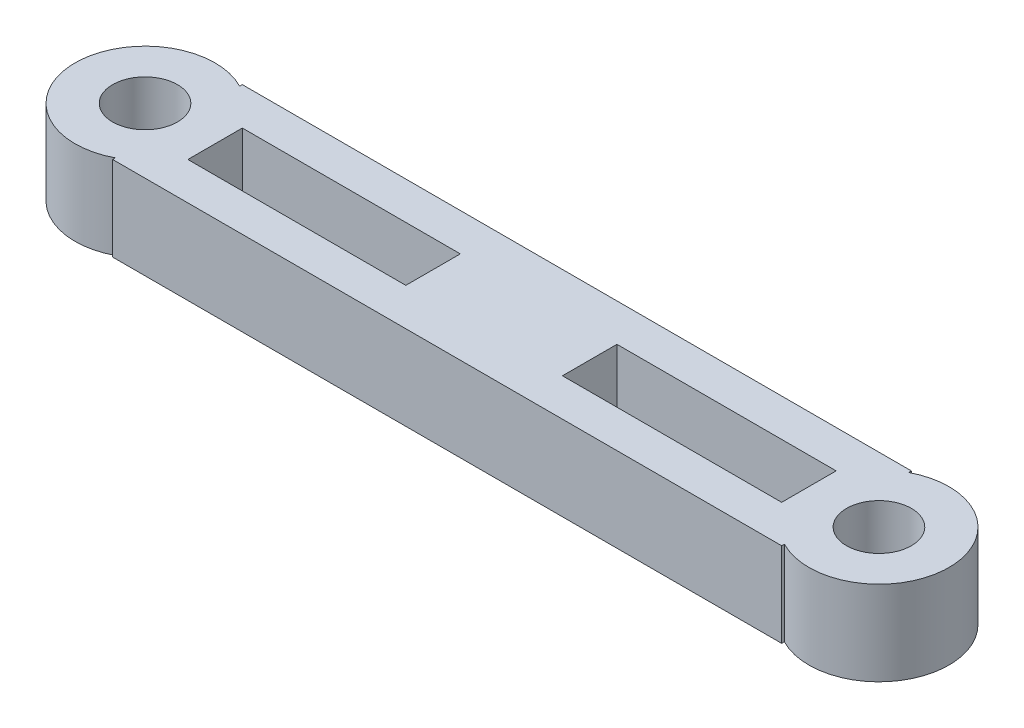
ISO-10303-21;
HEADER;
FILE_DESCRIPTION(('STEP AP214'),'2;1');
FILE_NAME('part.step','',(''),(''),'','','');
FILE_SCHEMA(('AUTOMOTIVE_DESIGN { 1 0 10303 214 1 1 1 1 }'));
ENDSEC;
DATA;
#1=APPLICATION_CONTEXT('core data for automotive mechanical design processes');
#2=APPLICATION_PROTOCOL_DEFINITION('international standard','automotive_design',2000,#1);
#3=PRODUCT_CONTEXT('',#1,'mechanical');
#4=PRODUCT('Part','Part','',(#3));
#5=PRODUCT_RELATED_PRODUCT_CATEGORY('part','',(#4));
#6=PRODUCT_DEFINITION_FORMATION('','',#4);
#7=PRODUCT_DEFINITION_CONTEXT('part definition',#1,'design');
#8=PRODUCT_DEFINITION('design','',#6,#7);
#9=PRODUCT_DEFINITION_SHAPE('','',#8);
#10=(LENGTH_UNIT() NAMED_UNIT(*) SI_UNIT(.MILLI.,.METRE.));
#11=(NAMED_UNIT(*) PLANE_ANGLE_UNIT() SI_UNIT($,.RADIAN.));
#12=(NAMED_UNIT(*) SI_UNIT($,.STERADIAN.) SOLID_ANGLE_UNIT());
#13=UNCERTAINTY_MEASURE_WITH_UNIT(LENGTH_MEASURE(1.E-05),#10,'distance_accuracy_value','');
#14=(GEOMETRIC_REPRESENTATION_CONTEXT(3) GLOBAL_UNCERTAINTY_ASSIGNED_CONTEXT((#13)) GLOBAL_UNIT_ASSIGNED_CONTEXT((#10,
#11,#12)) REPRESENTATION_CONTEXT('',''));
#15=CARTESIAN_POINT('',(0.,0.,0.));
#16=DIRECTION('',(0.,0.,1.));
#17=DIRECTION('',(1.,0.,0.));
#18=AXIS2_PLACEMENT_3D('',#15,#16,#17);
#19=CARTESIAN_POINT('',(11.3046804357248,2.78834830224153,-2.19075));
#20=DIRECTION('',(-1.,0.,0.));
#21=DIRECTION('',(0.,0.,1.));
#22=AXIS2_PLACEMENT_3D('',#19,#20,#21);
#23=PLANE('',#22);
#24=DIRECTION('',(0.,0.,1.));
#25=VECTOR('',#24,1.);
#26=CARTESIAN_POINT('',(11.3046804357248,12.7,-2.19075));
#27=LINE('',#26,#25);
#28=CARTESIAN_POINT('',(11.3046804357248,12.7,-2.19075));
#29=VERTEX_POINT('',#28);
#30=CARTESIAN_POINT('',(11.3046804357248,12.7,-2.09835770191108));
#31=VERTEX_POINT('',#30);
#32=EDGE_CURVE('E164',#29,#31,#27,.T.);
#33=ORIENTED_EDGE('',*,*,#32,.T.);
#34=DIRECTION('',(0.,1.,0.));
#35=VECTOR('',#34,1.);
#36=CARTESIAN_POINT('',(11.3046804357248,3.14745619981796,-2.09835770191108));
#37=LINE('',#36,#35);
#38=CARTESIAN_POINT('',(11.3046804357248,9.8425,-2.09835770191108));
#39=VERTEX_POINT('',#38);
#40=EDGE_CURVE('E51',#31,#39,#37,.F.);
#41=ORIENTED_EDGE('',*,*,#40,.T.);
#42=DIRECTION('',(0.,0.,1.));
#43=VECTOR('',#42,1.);
#44=CARTESIAN_POINT('',(11.3046804357248,9.8425,-2.19075));
#45=LINE('',#44,#43);
#46=CARTESIAN_POINT('',(11.3046804357248,9.8425,-2.19075));
#47=VERTEX_POINT('',#46);
#48=EDGE_CURVE('E161',#47,#39,#45,.T.);
#49=ORIENTED_EDGE('',*,*,#48,.F.);
#50=DIRECTION('',(0.,-1.,0.));
#51=VECTOR('',#50,1.);
#52=CARTESIAN_POINT('',(11.3046804357248,6.35,-2.19075));
#53=LINE('',#52,#51);
#54=EDGE_CURVE('E243',#29,#47,#53,.T.);
#55=ORIENTED_EDGE('',*,*,#54,.F.);
#56=EDGE_LOOP('',(#33,#41,#49,#55));
#57=FACE_BOUND('',#56,.T.);
#58=ADVANCED_FACE('F43',(#57),#23,.F.);
#59=CARTESIAN_POINT('',(-11.3046804357248,2.78834830224153,-2.19075));
#60=DIRECTION('',(1.,0.,0.));
#61=DIRECTION('',(0.,0.,-1.));
#62=AXIS2_PLACEMENT_3D('',#59,#60,#61);
#63=PLANE('',#62);
#64=DIRECTION('',(0.,0.,-1.));
#65=VECTOR('',#64,1.);
#66=CARTESIAN_POINT('',(-11.3046804357248,12.7,-2.19075));
#67=LINE('',#66,#65);
#68=CARTESIAN_POINT('',(-11.3046804357248,12.7,2.19075));
#69=VERTEX_POINT('',#68);
#70=CARTESIAN_POINT('',(-11.3046804357248,12.7,2.09835770191107));
#71=VERTEX_POINT('',#70);
#72=EDGE_CURVE('E283',#69,#71,#67,.T.);
#73=ORIENTED_EDGE('',*,*,#72,.T.);
#74=DIRECTION('',(0.,1.,0.));
#75=VECTOR('',#74,1.);
#76=CARTESIAN_POINT('',(-11.3046804357248,3.14745619981796,2.09835770191107));
#77=LINE('',#76,#75);
#78=CARTESIAN_POINT('',(-11.3046804357248,9.8425,2.09835770191107));
#79=VERTEX_POINT('',#78);
#80=EDGE_CURVE('E264',#71,#79,#77,.F.);
#81=ORIENTED_EDGE('',*,*,#80,.T.);
#82=DIRECTION('',(0.,0.,-1.));
#83=VECTOR('',#82,1.);
#84=CARTESIAN_POINT('',(-11.3046804357248,9.8425,-2.19075));
#85=LINE('',#84,#83);
#86=CARTESIAN_POINT('',(-11.3046804357248,9.8425,2.19075));
#87=VERTEX_POINT('',#86);
#88=EDGE_CURVE('E177',#87,#79,#85,.T.);
#89=ORIENTED_EDGE('',*,*,#88,.F.);
#90=DIRECTION('',(0.,-1.,0.));
#91=VECTOR('',#90,1.);
#92=CARTESIAN_POINT('',(-11.3046804357248,6.35,2.19075));
#93=LINE('',#92,#91);
#94=EDGE_CURVE('E248',#69,#87,#93,.T.);
#95=ORIENTED_EDGE('',*,*,#94,.F.);
#96=EDGE_LOOP('',(#73,#81,#89,#95));
#97=FACE_BOUND('',#96,.T.);
#98=ADVANCED_FACE('F311',(#97),#63,.F.);
#99=CARTESIAN_POINT('',(-11.3046804357248,12.7,0.));
#100=DIRECTION('',(0.,1.,0.));
#101=DIRECTION('',(0.,0.,1.));
#102=AXIS2_PLACEMENT_3D('',#99,#100,#101);
#103=PLANE('',#102);
#104=DIRECTION('',(1.,0.,0.));
#105=VECTOR('',#104,1.);
#106=CARTESIAN_POINT('',(0.,12.7,-0.920750000000002));
#107=LINE('',#106,#105);
#108=CARTESIAN_POINT('',(2.62570322069643,12.7,-0.920750000000002));
#109=VERTEX_POINT('',#108);
#110=CARTESIAN_POINT('',(10.033,12.7,-0.920750000000002));
#111=VERTEX_POINT('',#110);
#112=EDGE_CURVE('E229',#109,#111,#107,.T.);
#113=ORIENTED_EDGE('',*,*,#112,.T.);
#114=DIRECTION('',(0.,0.,-1.));
#115=VECTOR('',#114,1.);
#116=CARTESIAN_POINT('',(10.033,12.7,-0.920750000000002));
#117=LINE('',#116,#115);
#118=CARTESIAN_POINT('',(10.033,12.7,0.920749999999999));
#119=VERTEX_POINT('',#118);
#120=EDGE_CURVE('E214',#119,#111,#117,.T.);
#121=ORIENTED_EDGE('',*,*,#120,.F.);
#122=DIRECTION('',(1.,0.,0.));
#123=VECTOR('',#122,1.);
#124=CARTESIAN_POINT('',(0.,12.7,0.920749999999999));
#125=LINE('',#124,#123);
#126=CARTESIAN_POINT('',(2.62570322069643,12.7,0.920749999999999));
#127=VERTEX_POINT('',#126);
#128=EDGE_CURVE('E232',#127,#119,#125,.T.);
#129=ORIENTED_EDGE('',*,*,#128,.F.);
#130=DIRECTION('',(0.,0.,1.));
#131=VECTOR('',#130,1.);
#132=CARTESIAN_POINT('',(2.62570322069643,12.7,-0.920750000000002));
#133=LINE('',#132,#131);
#134=EDGE_CURVE('E207',#109,#127,#133,.T.);
#135=ORIENTED_EDGE('',*,*,#134,.F.);
#136=EDGE_LOOP('',(#113,#121,#129,#135));
#137=FACE_BOUND('',#136,.T.);
#138=CARTESIAN_POINT('',(12.4000554357248,12.7,0.));
#139=DIRECTION('',(0.,1.,0.));
#140=DIRECTION('',(0.,0.,1.));
#141=AXIS2_PLACEMENT_3D('',#138,#139,#140);
#142=CIRCLE('',#141,2.36705543572484);
#143=CARTESIAN_POINT('',(11.3046804357248,12.7,2.09835770191104));
#144=VERTEX_POINT('',#143);
#145=EDGE_CURVE('E292',#144,#31,#142,.T.);
#146=ORIENTED_EDGE('',*,*,#145,.T.);
#147=ORIENTED_EDGE('',*,*,#32,.F.);
#148=DIRECTION('',(-1.,0.,0.));
#149=VECTOR('',#148,1.);
#150=CARTESIAN_POINT('',(11.3046804357248,12.7,-2.19075));
#151=LINE('',#150,#149);
#152=CARTESIAN_POINT('',(-11.3046804357248,12.7,-2.19075));
#153=VERTEX_POINT('',#152);
#154=EDGE_CURVE('E235',#29,#153,#151,.T.);
#155=ORIENTED_EDGE('',*,*,#154,.T.);
#156=CARTESIAN_POINT('',(-11.3046804357248,12.7,-2.09835770191107));
#157=VERTEX_POINT('',#156);
#158=EDGE_CURVE('E180',#157,#153,#67,.T.);
#159=ORIENTED_EDGE('',*,*,#158,.F.);
#160=CARTESIAN_POINT('',(-12.4000554357248,12.7,0.));
#161=DIRECTION('',(0.,1.,0.));
#162=DIRECTION('',(0.,0.,1.));
#163=AXIS2_PLACEMENT_3D('',#160,#161,#162);
#164=CIRCLE('',#163,2.36705543572484);
#165=EDGE_CURVE('E280',#157,#71,#164,.T.);
#166=ORIENTED_EDGE('',*,*,#165,.T.);
#167=ORIENTED_EDGE('',*,*,#72,.F.);
#168=DIRECTION('',(-1.,0.,0.));
#169=VECTOR('',#168,1.);
#170=CARTESIAN_POINT('',(11.3046804357248,12.7,2.19075));
#171=LINE('',#170,#169);
#172=CARTESIAN_POINT('',(11.3046804357248,12.7,2.19075));
#173=VERTEX_POINT('',#172);
#174=EDGE_CURVE('E240',#173,#69,#171,.T.);
#175=ORIENTED_EDGE('',*,*,#174,.F.);
#176=EDGE_CURVE('E171',#144,#173,#27,.T.);
#177=ORIENTED_EDGE('',*,*,#176,.F.);
#178=EDGE_LOOP('',(#146,#147,#155,#159,#166,#167,#175,#177));
#179=FACE_BOUND('',#178,.T.);
#180=DIRECTION('',(1.,0.,0.));
#181=VECTOR('',#180,1.);
#182=CARTESIAN_POINT('',(-9.525,12.7,0.92075));
#183=LINE('',#182,#181);
#184=CARTESIAN_POINT('',(-10.033,12.7,0.920749999999999));
#185=VERTEX_POINT('',#184);
#186=CARTESIAN_POINT('',(-2.667,12.7,0.920749999999999));
#187=VERTEX_POINT('',#186);
#188=EDGE_CURVE('E233',#185,#187,#183,.T.);
#189=ORIENTED_EDGE('',*,*,#188,.F.);
#190=DIRECTION('',(0.,0.,1.));
#191=VECTOR('',#190,1.);
#192=CARTESIAN_POINT('',(-10.033,12.7,-0.920749999999999));
#193=LINE('',#192,#191);
#194=CARTESIAN_POINT('',(-10.033,12.7,-0.920749999999999));
#195=VERTEX_POINT('',#194);
#196=EDGE_CURVE('E185',#195,#185,#193,.T.);
#197=ORIENTED_EDGE('',*,*,#196,.F.);
#198=DIRECTION('',(1.,0.,0.));
#199=VECTOR('',#198,1.);
#200=CARTESIAN_POINT('',(-9.525,12.7,-0.92075));
#201=LINE('',#200,#199);
#202=CARTESIAN_POINT('',(-2.667,12.7,-0.920749999999999));
#203=VERTEX_POINT('',#202);
#204=EDGE_CURVE('E228',#195,#203,#201,.T.);
#205=ORIENTED_EDGE('',*,*,#204,.T.);
#206=DIRECTION('',(0.,0.,-1.));
#207=VECTOR('',#206,1.);
#208=CARTESIAN_POINT('',(-2.667,12.7,-0.920749999999999));
#209=LINE('',#208,#207);
#210=EDGE_CURVE('E181',#187,#203,#209,.T.);
#211=ORIENTED_EDGE('',*,*,#210,.F.);
#212=EDGE_LOOP('',(#189,#197,#205,#211));
#213=FACE_BOUND('',#212,.T.);
#214=CARTESIAN_POINT('',(-12.4000554357248,12.7,0.));
#215=DIRECTION('',(0.,1.,0.));
#216=DIRECTION('',(0.,0.,1.));
#217=AXIS2_PLACEMENT_3D('',#214,#215,#216);
#218=CIRCLE('',#217,1.095375);
#219=CARTESIAN_POINT('',(-12.4000554357248,12.7,1.095375));
#220=VERTEX_POINT('',#219);
#221=EDGE_CURVE('E288',#220,#220,#218,.T.);
#222=ORIENTED_EDGE('',*,*,#221,.F.);
#223=EDGE_LOOP('',(#222));
#224=FACE_BOUND('',#223,.T.);
#225=CARTESIAN_POINT('',(12.4000554357248,12.7,0.));
#226=DIRECTION('',(0.,1.,0.));
#227=DIRECTION('',(0.,0.,1.));
#228=AXIS2_PLACEMENT_3D('',#225,#226,#227);
#229=CIRCLE('',#228,1.095375);
#230=CARTESIAN_POINT('',(12.4000554357248,12.7,1.09537499999998));
#231=VERTEX_POINT('',#230);
#232=EDGE_CURVE('E157',#231,#231,#229,.T.);
#233=ORIENTED_EDGE('',*,*,#232,.F.);
#234=EDGE_LOOP('',(#233));
#235=FACE_BOUND('',#234,.T.);
#236=ADVANCED_FACE('F277',(#137,#179,#213,#224,#235),#103,.T.);
#237=CARTESIAN_POINT('',(0.,9.8425,0.));
#238=DIRECTION('',(0.,-1.,0.));
#239=DIRECTION('',(0.,0.,-1.));
#240=AXIS2_PLACEMENT_3D('',#237,#238,#239);
#241=PLANE('',#240);
#242=DIRECTION('',(0.,0.,-1.));
#243=VECTOR('',#242,1.);
#244=CARTESIAN_POINT('',(10.033,9.8425,0.));
#245=LINE('',#244,#243);
#246=CARTESIAN_POINT('',(10.033,9.8425,0.920749999999999));
#247=VERTEX_POINT('',#246);
#248=CARTESIAN_POINT('',(10.033,9.8425,-0.920750000000002));
#249=VERTEX_POINT('',#248);
#250=EDGE_CURVE('E257',#247,#249,#245,.T.);
#251=ORIENTED_EDGE('',*,*,#250,.T.);
#252=DIRECTION('',(-1.,0.,0.));
#253=VECTOR('',#252,1.);
#254=CARTESIAN_POINT('',(0.,9.8425,-0.920750000000002));
#255=LINE('',#254,#253);
#256=CARTESIAN_POINT('',(2.62570322069643,9.8425,-0.920750000000002));
#257=VERTEX_POINT('',#256);
#258=EDGE_CURVE('E184',#249,#257,#255,.T.);
#259=ORIENTED_EDGE('',*,*,#258,.T.);
#260=DIRECTION('',(0.,0.,1.));
#261=VECTOR('',#260,1.);
#262=CARTESIAN_POINT('',(2.62570322069643,9.8425,0.));
#263=LINE('',#262,#261);
#264=CARTESIAN_POINT('',(2.62570322069643,9.8425,0.920749999999999));
#265=VERTEX_POINT('',#264);
#266=EDGE_CURVE('E254',#257,#265,#263,.T.);
#267=ORIENTED_EDGE('',*,*,#266,.T.);
#268=DIRECTION('',(-1.,0.,0.));
#269=VECTOR('',#268,1.);
#270=CARTESIAN_POINT('',(0.,9.8425,0.920749999999998));
#271=LINE('',#270,#269);
#272=EDGE_CURVE('E217',#247,#265,#271,.T.);
#273=ORIENTED_EDGE('',*,*,#272,.F.);
#274=EDGE_LOOP('',(#251,#259,#267,#273));
#275=FACE_BOUND('',#274,.T.);
#276=CARTESIAN_POINT('',(12.4000554357248,9.8425,0.));
#277=DIRECTION('',(0.,-1.,0.));
#278=DIRECTION('',(0.,0.,-1.));
#279=AXIS2_PLACEMENT_3D('',#276,#277,#278);
#280=CIRCLE('',#279,2.36705543572484);
#281=CARTESIAN_POINT('',(11.3046804357248,9.8425,2.09835770191105));
#282=VERTEX_POINT('',#281);
#283=EDGE_CURVE('E58',#282,#39,#280,.F.);
#284=ORIENTED_EDGE('',*,*,#283,.F.);
#285=CARTESIAN_POINT('',(11.3046804357248,9.8425,2.19075));
#286=VERTEX_POINT('',#285);
#287=EDGE_CURVE('E172',#282,#286,#45,.T.);
#288=ORIENTED_EDGE('',*,*,#287,.T.);
#289=DIRECTION('',(1.,0.,0.));
#290=VECTOR('',#289,1.);
#291=CARTESIAN_POINT('',(0.,9.8425,2.19075));
#292=LINE('',#291,#290);
#293=EDGE_CURVE('E224',#87,#286,#292,.T.);
#294=ORIENTED_EDGE('',*,*,#293,.F.);
#295=ORIENTED_EDGE('',*,*,#88,.T.);
#296=CARTESIAN_POINT('',(-12.4000554357248,9.8425,0.));
#297=DIRECTION('',(0.,-1.,0.));
#298=DIRECTION('',(0.,0.,-1.));
#299=AXIS2_PLACEMENT_3D('',#296,#297,#298);
#300=CIRCLE('',#299,2.36705543572484);
#301=CARTESIAN_POINT('',(-11.3046804357248,9.8425,-2.09835770191107));
#302=VERTEX_POINT('',#301);
#303=EDGE_CURVE('E65',#302,#79,#300,.F.);
#304=ORIENTED_EDGE('',*,*,#303,.F.);
#305=CARTESIAN_POINT('',(-11.3046804357248,9.8425,-2.19075));
#306=VERTEX_POINT('',#305);
#307=EDGE_CURVE('E273',#302,#306,#85,.T.);
#308=ORIENTED_EDGE('',*,*,#307,.T.);
#309=DIRECTION('',(1.,0.,0.));
#310=VECTOR('',#309,1.);
#311=CARTESIAN_POINT('',(0.,9.8425,-2.19075));
#312=LINE('',#311,#310);
#313=EDGE_CURVE('E169',#306,#47,#312,.T.);
#314=ORIENTED_EDGE('',*,*,#313,.T.);
#315=ORIENTED_EDGE('',*,*,#48,.T.);
#316=EDGE_LOOP('',(#284,#288,#294,#295,#304,#308,#314,#315));
#317=FACE_BOUND('',#316,.T.);
#318=DIRECTION('',(0.,0.,1.));
#319=VECTOR('',#318,1.);
#320=CARTESIAN_POINT('',(-10.033,9.8425,0.));
#321=LINE('',#320,#319);
#322=CARTESIAN_POINT('',(-10.033,9.8425,-0.920749999999999));
#323=VERTEX_POINT('',#322);
#324=CARTESIAN_POINT('',(-10.033,9.8425,0.920749999999999));
#325=VERTEX_POINT('',#324);
#326=EDGE_CURVE('E259',#323,#325,#321,.T.);
#327=ORIENTED_EDGE('',*,*,#326,.T.);
#328=DIRECTION('',(-1.,0.,0.));
#329=VECTOR('',#328,1.);
#330=CARTESIAN_POINT('',(0.,9.8425,0.920749999999998));
#331=LINE('',#330,#329);
#332=CARTESIAN_POINT('',(-2.667,9.8425,0.920749999999999));
#333=VERTEX_POINT('',#332);
#334=EDGE_CURVE('E221',#333,#325,#331,.T.);
#335=ORIENTED_EDGE('',*,*,#334,.F.);
#336=DIRECTION('',(0.,0.,-1.));
#337=VECTOR('',#336,1.);
#338=CARTESIAN_POINT('',(-2.667,9.8425,0.));
#339=LINE('',#338,#337);
#340=CARTESIAN_POINT('',(-2.667,9.8425,-0.920749999999999));
#341=VERTEX_POINT('',#340);
#342=EDGE_CURVE('E261',#333,#341,#339,.T.);
#343=ORIENTED_EDGE('',*,*,#342,.T.);
#344=DIRECTION('',(-1.,0.,0.));
#345=VECTOR('',#344,1.);
#346=CARTESIAN_POINT('',(0.,9.8425,-0.920750000000001));
#347=LINE('',#346,#345);
#348=EDGE_CURVE('E219',#341,#323,#347,.T.);
#349=ORIENTED_EDGE('',*,*,#348,.T.);
#350=EDGE_LOOP('',(#327,#335,#343,#349));
#351=FACE_BOUND('',#350,.T.);
#352=CARTESIAN_POINT('',(-12.4000554357248,9.8425,0.));
#353=DIRECTION('',(0.,-1.,0.));
#354=DIRECTION('',(0.,0.,-1.));
#355=AXIS2_PLACEMENT_3D('',#352,#353,#354);
#356=CIRCLE('',#355,1.095375);
#357=CARTESIAN_POINT('',(-12.4000554357248,9.8425,-1.095375));
#358=VERTEX_POINT('',#357);
#359=EDGE_CURVE('E175',#358,#358,#356,.F.);
#360=ORIENTED_EDGE('',*,*,#359,.T.);
#361=EDGE_LOOP('',(#360));
#362=FACE_BOUND('',#361,.T.);
#363=CARTESIAN_POINT('',(12.4000554357248,9.8425,0.));
#364=DIRECTION('',(0.,-1.,0.));
#365=DIRECTION('',(0.,0.,-1.));
#366=AXIS2_PLACEMENT_3D('',#363,#364,#365);
#367=CIRCLE('',#366,1.095375);
#368=CARTESIAN_POINT('',(12.4000554357248,9.8425,-1.09537500000002));
#369=VERTEX_POINT('',#368);
#370=EDGE_CURVE('E294',#369,#369,#367,.F.);
#371=ORIENTED_EDGE('',*,*,#370,.T.);
#372=EDGE_LOOP('',(#371));
#373=FACE_BOUND('',#372,.T.);
#374=ADVANCED_FACE('F166',(#275,#317,#351,#362,#373),#241,.T.);
#375=CARTESIAN_POINT('',(0.,6.35,-2.19075));
#376=DIRECTION('',(0.,0.,1.));
#377=DIRECTION('',(1.,0.,0.));
#378=AXIS2_PLACEMENT_3D('',#375,#376,#377);
#379=PLANE('',#378);
#380=ORIENTED_EDGE('',*,*,#313,.F.);
#381=DIRECTION('',(0.,-1.,0.));
#382=VECTOR('',#381,1.);
#383=CARTESIAN_POINT('',(-11.3046804357248,6.35,-2.19075));
#384=LINE('',#383,#382);
#385=EDGE_CURVE('E251',#153,#306,#384,.T.);
#386=ORIENTED_EDGE('',*,*,#385,.F.);
#387=ORIENTED_EDGE('',*,*,#154,.F.);
#388=ORIENTED_EDGE('',*,*,#54,.T.);
#389=EDGE_LOOP('',(#380,#386,#387,#388));
#390=FACE_BOUND('',#389,.T.);
#391=ADVANCED_FACE('F339',(#390),#379,.F.);
#392=CARTESIAN_POINT('',(0.,6.35,2.19075));
#393=DIRECTION('',(0.,0.,1.));
#394=DIRECTION('',(1.,0.,0.));
#395=AXIS2_PLACEMENT_3D('',#392,#393,#394);
#396=PLANE('',#395);
#397=ORIENTED_EDGE('',*,*,#94,.T.);
#398=ORIENTED_EDGE('',*,*,#293,.T.);
#399=DIRECTION('',(0.,-1.,0.));
#400=VECTOR('',#399,1.);
#401=CARTESIAN_POINT('',(11.3046804357248,6.35,2.19075));
#402=LINE('',#401,#400);
#403=EDGE_CURVE('E245',#173,#286,#402,.T.);
#404=ORIENTED_EDGE('',*,*,#403,.F.);
#405=ORIENTED_EDGE('',*,*,#174,.T.);
#406=EDGE_LOOP('',(#397,#398,#404,#405));
#407=FACE_BOUND('',#406,.T.);
#408=ADVANCED_FACE('F336',(#407),#396,.T.);
#409=CARTESIAN_POINT('',(0.,6.35,0.920749999999998));
#410=DIRECTION('',(0.,0.,-1.));
#411=DIRECTION('',(-1.,0.,0.));
#412=AXIS2_PLACEMENT_3D('',#409,#410,#411);
#413=PLANE('',#412);
#414=ORIENTED_EDGE('',*,*,#188,.T.);
#415=DIRECTION('',(0.,-1.,0.));
#416=VECTOR('',#415,1.);
#417=CARTESIAN_POINT('',(-2.667,20.3327693419021,0.920749999999999));
#418=LINE('',#417,#416);
#419=EDGE_CURVE('E191',#187,#333,#418,.T.);
#420=ORIENTED_EDGE('',*,*,#419,.T.);
#421=ORIENTED_EDGE('',*,*,#334,.T.);
#422=DIRECTION('',(0.,-1.,0.));
#423=VECTOR('',#422,1.);
#424=CARTESIAN_POINT('',(-10.033,20.3327693419021,0.920749999999999));
#425=LINE('',#424,#423);
#426=EDGE_CURVE('E188',#185,#325,#425,.T.);
#427=ORIENTED_EDGE('',*,*,#426,.F.);
#428=EDGE_LOOP('',(#414,#420,#421,#427));
#429=FACE_BOUND('',#428,.T.);
#430=ADVANCED_FACE('F344',(#429),#413,.T.);
#431=CARTESIAN_POINT('',(0.,6.35,-0.920750000000001));
#432=DIRECTION('',(0.,0.,-1.));
#433=DIRECTION('',(-1.,0.,0.));
#434=AXIS2_PLACEMENT_3D('',#431,#432,#433);
#435=PLANE('',#434);
#436=ORIENTED_EDGE('',*,*,#348,.F.);
#437=DIRECTION('',(0.,-1.,0.));
#438=VECTOR('',#437,1.);
#439=CARTESIAN_POINT('',(-2.667,20.3327693419021,-0.920749999999999));
#440=LINE('',#439,#438);
#441=EDGE_CURVE('E187',#203,#341,#440,.T.);
#442=ORIENTED_EDGE('',*,*,#441,.F.);
#443=ORIENTED_EDGE('',*,*,#204,.F.);
#444=DIRECTION('',(0.,-1.,0.));
#445=VECTOR('',#444,1.);
#446=CARTESIAN_POINT('',(-10.033,20.3327693419021,-0.920749999999999));
#447=LINE('',#446,#445);
#448=EDGE_CURVE('E192',#195,#323,#447,.T.);
#449=ORIENTED_EDGE('',*,*,#448,.T.);
#450=EDGE_LOOP('',(#436,#442,#443,#449));
#451=FACE_BOUND('',#450,.T.);
#452=ADVANCED_FACE('F351',(#451),#435,.F.);
#453=CARTESIAN_POINT('',(0.,6.35,0.920749999999998));
#454=DIRECTION('',(0.,0.,-1.));
#455=DIRECTION('',(-1.,0.,0.));
#456=AXIS2_PLACEMENT_3D('',#453,#454,#455);
#457=PLANE('',#456);
#458=ORIENTED_EDGE('',*,*,#128,.T.);
#459=DIRECTION('',(0.,-1.,0.));
#460=VECTOR('',#459,1.);
#461=CARTESIAN_POINT('',(10.033,20.3327693419021,0.920749999999999));
#462=LINE('',#461,#460);
#463=EDGE_CURVE('E206',#119,#247,#462,.T.);
#464=ORIENTED_EDGE('',*,*,#463,.T.);
#465=ORIENTED_EDGE('',*,*,#272,.T.);
#466=DIRECTION('',(0.,-1.,0.));
#467=VECTOR('',#466,1.);
#468=CARTESIAN_POINT('',(2.62570322069643,20.3327693419021,0.920749999999999));
#469=LINE('',#468,#467);
#470=EDGE_CURVE('E202',#127,#265,#469,.T.);
#471=ORIENTED_EDGE('',*,*,#470,.F.);
#472=EDGE_LOOP('',(#458,#464,#465,#471));
#473=FACE_BOUND('',#472,.T.);
#474=ADVANCED_FACE('F45',(#473),#457,.T.);
#475=CARTESIAN_POINT('',(0.,6.35,-0.920750000000002));
#476=DIRECTION('',(0.,0.,-1.));
#477=DIRECTION('',(-1.,0.,0.));
#478=AXIS2_PLACEMENT_3D('',#475,#476,#477);
#479=PLANE('',#478);
#480=ORIENTED_EDGE('',*,*,#258,.F.);
#481=DIRECTION('',(0.,-1.,0.));
#482=VECTOR('',#481,1.);
#483=CARTESIAN_POINT('',(10.033,20.3327693419021,-0.920750000000002));
#484=LINE('',#483,#482);
#485=EDGE_CURVE('E203',#111,#249,#484,.T.);
#486=ORIENTED_EDGE('',*,*,#485,.F.);
#487=ORIENTED_EDGE('',*,*,#112,.F.);
#488=DIRECTION('',(0.,-1.,0.));
#489=VECTOR('',#488,1.);
#490=CARTESIAN_POINT('',(2.62570322069643,20.3327693419021,-0.920750000000002));
#491=LINE('',#490,#489);
#492=EDGE_CURVE('E199',#109,#257,#491,.T.);
#493=ORIENTED_EDGE('',*,*,#492,.T.);
#494=EDGE_LOOP('',(#480,#486,#487,#493));
#495=FACE_BOUND('',#494,.T.);
#496=ADVANCED_FACE('F357',(#495),#479,.F.);
#497=CARTESIAN_POINT('',(2.62570322069643,20.3327693419021,-0.920750000000002));
#498=DIRECTION('',(1.,0.,0.));
#499=DIRECTION('',(0.,0.,-1.));
#500=AXIS2_PLACEMENT_3D('',#497,#498,#499);
#501=PLANE('',#500);
#502=ORIENTED_EDGE('',*,*,#492,.F.);
#503=ORIENTED_EDGE('',*,*,#134,.T.);
#504=ORIENTED_EDGE('',*,*,#470,.T.);
#505=ORIENTED_EDGE('',*,*,#266,.F.);
#506=EDGE_LOOP('',(#502,#503,#504,#505));
#507=FACE_BOUND('',#506,.T.);
#508=ADVANCED_FACE('F359',(#507),#501,.T.);
#509=CARTESIAN_POINT('',(10.033,20.3327693419021,-0.920750000000002));
#510=DIRECTION('',(-1.,0.,0.));
#511=DIRECTION('',(0.,0.,1.));
#512=AXIS2_PLACEMENT_3D('',#509,#510,#511);
#513=PLANE('',#512);
#514=ORIENTED_EDGE('',*,*,#120,.T.);
#515=ORIENTED_EDGE('',*,*,#485,.T.);
#516=ORIENTED_EDGE('',*,*,#250,.F.);
#517=ORIENTED_EDGE('',*,*,#463,.F.);
#518=EDGE_LOOP('',(#514,#515,#516,#517));
#519=FACE_BOUND('',#518,.T.);
#520=ADVANCED_FACE('F365',(#519),#513,.T.);
#521=CARTESIAN_POINT('',(-10.033,20.3327693419021,-0.920749999999999));
#522=DIRECTION('',(1.,0.,0.));
#523=DIRECTION('',(0.,0.,-1.));
#524=AXIS2_PLACEMENT_3D('',#521,#522,#523);
#525=PLANE('',#524);
#526=ORIENTED_EDGE('',*,*,#196,.T.);
#527=ORIENTED_EDGE('',*,*,#426,.T.);
#528=ORIENTED_EDGE('',*,*,#326,.F.);
#529=ORIENTED_EDGE('',*,*,#448,.F.);
#530=EDGE_LOOP('',(#526,#527,#528,#529));
#531=FACE_BOUND('',#530,.T.);
#532=ADVANCED_FACE('F330',(#531),#525,.T.);
#533=CARTESIAN_POINT('',(-2.667,20.3327693419021,-0.920749999999999));
#534=DIRECTION('',(-1.,0.,0.));
#535=DIRECTION('',(0.,0.,1.));
#536=AXIS2_PLACEMENT_3D('',#533,#534,#535);
#537=PLANE('',#536);
#538=ORIENTED_EDGE('',*,*,#419,.F.);
#539=ORIENTED_EDGE('',*,*,#210,.T.);
#540=ORIENTED_EDGE('',*,*,#441,.T.);
#541=ORIENTED_EDGE('',*,*,#342,.F.);
#542=EDGE_LOOP('',(#538,#539,#540,#541));
#543=FACE_BOUND('',#542,.T.);
#544=ADVANCED_FACE('F322',(#543),#537,.T.);
#545=ORIENTED_EDGE('',*,*,#287,.F.);
#546=DIRECTION('',(0.,1.,0.));
#547=VECTOR('',#546,1.);
#548=CARTESIAN_POINT('',(11.3046804357248,3.14745619981796,2.09835770191104));
#549=LINE('',#548,#547);
#550=EDGE_CURVE('E11',#282,#144,#549,.T.);
#551=ORIENTED_EDGE('',*,*,#550,.T.);
#552=ORIENTED_EDGE('',*,*,#176,.T.);
#553=ORIENTED_EDGE('',*,*,#403,.T.);
#554=EDGE_LOOP('',(#545,#551,#552,#553));
#555=FACE_BOUND('',#554,.T.);
#556=ADVANCED_FACE('F313',(#555),#23,.F.);
#557=ORIENTED_EDGE('',*,*,#307,.F.);
#558=DIRECTION('',(0.,1.,0.));
#559=VECTOR('',#558,1.);
#560=CARTESIAN_POINT('',(-11.3046804357248,3.14745619981796,-2.09835770191107));
#561=LINE('',#560,#559);
#562=EDGE_CURVE('E165',#302,#157,#561,.T.);
#563=ORIENTED_EDGE('',*,*,#562,.T.);
#564=ORIENTED_EDGE('',*,*,#158,.T.);
#565=ORIENTED_EDGE('',*,*,#385,.T.);
#566=EDGE_LOOP('',(#557,#563,#564,#565));
#567=FACE_BOUND('',#566,.T.);
#568=ADVANCED_FACE('F271',(#567),#63,.F.);
#569=CARTESIAN_POINT('',(-12.4000554357248,3.14745619981796,0.));
#570=DIRECTION('',(0.,1.,0.));
#571=DIRECTION('',(0.,0.,1.));
#572=AXIS2_PLACEMENT_3D('',#569,#570,#571);
#573=CYLINDRICAL_SURFACE('',#572,2.36705543572484);
#574=ORIENTED_EDGE('',*,*,#562,.F.);
#575=ORIENTED_EDGE('',*,*,#303,.T.);
#576=ORIENTED_EDGE('',*,*,#80,.F.);
#577=ORIENTED_EDGE('',*,*,#165,.F.);
#578=EDGE_LOOP('',(#574,#575,#576,#577));
#579=FACE_BOUND('',#578,.T.);
#580=ADVANCED_FACE('F328',(#579),#573,.T.);
#581=CARTESIAN_POINT('',(-12.4000554357248,3.14745619981796,0.));
#582=DIRECTION('',(0.,1.,0.));
#583=DIRECTION('',(0.,0.,1.));
#584=AXIS2_PLACEMENT_3D('',#581,#582,#583);
#585=CYLINDRICAL_SURFACE('',#584,1.095375);
#586=ORIENTED_EDGE('',*,*,#221,.T.);
#587=EDGE_LOOP('',(#586));
#588=FACE_BOUND('',#587,.T.);
#589=ORIENTED_EDGE('',*,*,#359,.F.);
#590=EDGE_LOOP('',(#589));
#591=FACE_BOUND('',#590,.T.);
#592=ADVANCED_FACE('F308',(#588,#591),#585,.F.);
#593=CARTESIAN_POINT('',(12.4000554357248,3.14745619981796,0.));
#594=DIRECTION('',(0.,1.,0.));
#595=DIRECTION('',(0.,0.,1.));
#596=AXIS2_PLACEMENT_3D('',#593,#594,#595);
#597=CYLINDRICAL_SURFACE('',#596,2.36705543572484);
#598=ORIENTED_EDGE('',*,*,#550,.F.);
#599=ORIENTED_EDGE('',*,*,#283,.T.);
#600=ORIENTED_EDGE('',*,*,#40,.F.);
#601=ORIENTED_EDGE('',*,*,#145,.F.);
#602=EDGE_LOOP('',(#598,#599,#600,#601));
#603=FACE_BOUND('',#602,.T.);
#604=ADVANCED_FACE('F154',(#603),#597,.T.);
#605=CARTESIAN_POINT('',(12.4000554357248,3.14745619981796,0.));
#606=DIRECTION('',(0.,1.,0.));
#607=DIRECTION('',(0.,0.,1.));
#608=AXIS2_PLACEMENT_3D('',#605,#606,#607);
#609=CYLINDRICAL_SURFACE('',#608,1.095375);
#610=ORIENTED_EDGE('',*,*,#232,.T.);
#611=EDGE_LOOP('',(#610));
#612=FACE_BOUND('',#611,.T.);
#613=ORIENTED_EDGE('',*,*,#370,.F.);
#614=EDGE_LOOP('',(#613));
#615=FACE_BOUND('',#614,.T.);
#616=ADVANCED_FACE('F301',(#612,#615),#609,.F.);
#617=CLOSED_SHELL('',(#58,#98,#236,#374,#391,#408,#430,#452,#474,#496,#508,#520,#532,#544,#556,
#568,#580,#592,#604,#616));
#618=MANIFOLD_SOLID_BREP('B2',#617);
#619=ADVANCED_BREP_SHAPE_REPRESENTATION('',(#18,#618),#14);
#620=SHAPE_DEFINITION_REPRESENTATION(#9,#619);
ENDSEC;
END-ISO-10303-21;
